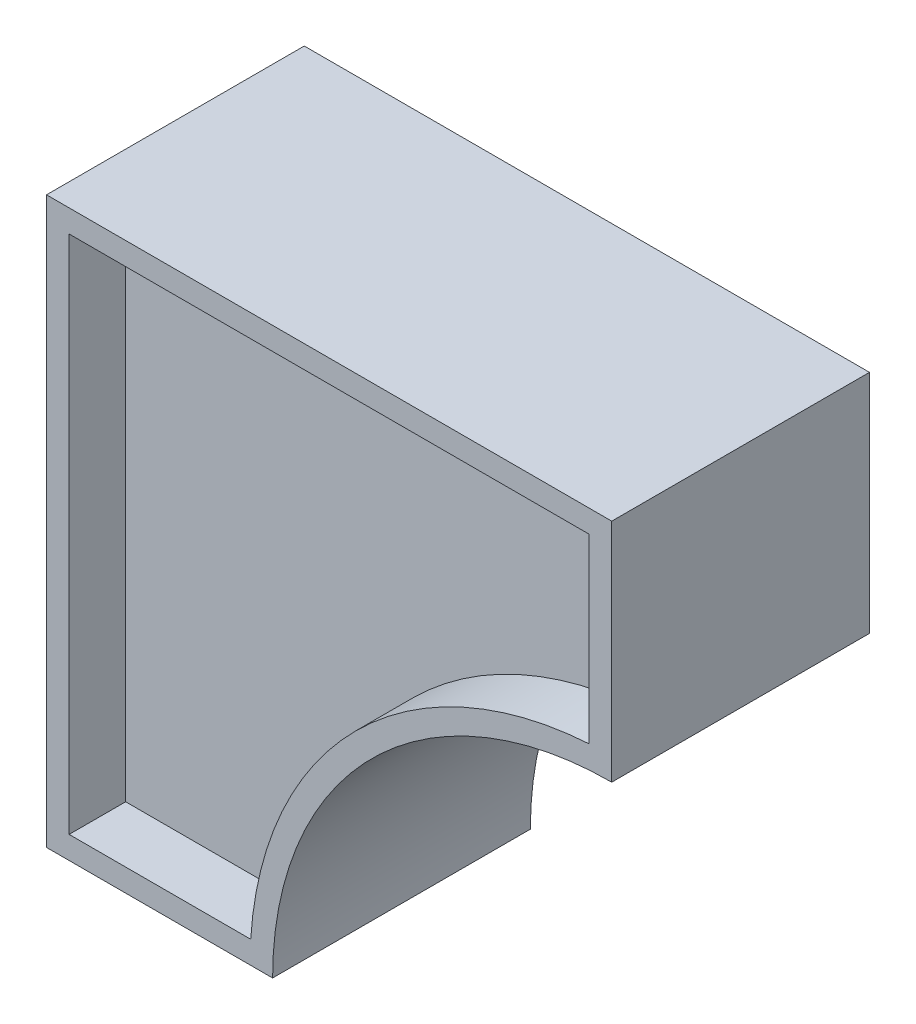
ISO-10303-21;
HEADER;
FILE_DESCRIPTION(('STEP AP214'),'2;1');
FILE_NAME('part.step','',(''),(''),'','','');
FILE_SCHEMA(('AUTOMOTIVE_DESIGN { 1 0 10303 214 1 1 1 1 }'));
ENDSEC;
DATA;
#1=APPLICATION_CONTEXT('core data for automotive mechanical design processes');
#2=APPLICATION_PROTOCOL_DEFINITION('international standard','automotive_design',2000,#1);
#3=PRODUCT_CONTEXT('',#1,'mechanical');
#4=PRODUCT('Part','Part','',(#3));
#5=PRODUCT_RELATED_PRODUCT_CATEGORY('part','',(#4));
#6=PRODUCT_DEFINITION_FORMATION('','',#4);
#7=PRODUCT_DEFINITION_CONTEXT('part definition',#1,'design');
#8=PRODUCT_DEFINITION('design','',#6,#7);
#9=PRODUCT_DEFINITION_SHAPE('','',#8);
#10=(LENGTH_UNIT() NAMED_UNIT(*) SI_UNIT(.MILLI.,.METRE.));
#11=(NAMED_UNIT(*) PLANE_ANGLE_UNIT() SI_UNIT($,.RADIAN.));
#12=(NAMED_UNIT(*) SI_UNIT($,.STERADIAN.) SOLID_ANGLE_UNIT());
#13=UNCERTAINTY_MEASURE_WITH_UNIT(LENGTH_MEASURE(1.E-05),#10,'distance_accuracy_value','');
#14=(GEOMETRIC_REPRESENTATION_CONTEXT(3) GLOBAL_UNCERTAINTY_ASSIGNED_CONTEXT((#13)) GLOBAL_UNIT_ASSIGNED_CONTEXT((#10,
#11,#12)) REPRESENTATION_CONTEXT('',''));
#15=CARTESIAN_POINT('',(0.,0.,0.));
#16=DIRECTION('',(0.,0.,1.));
#17=DIRECTION('',(1.,0.,0.));
#18=AXIS2_PLACEMENT_3D('',#15,#16,#17);
#19=CARTESIAN_POINT('',(0.,0.,28.956));
#20=DIRECTION('',(1.,0.,0.));
#21=DIRECTION('',(0.,1.,0.));
#22=AXIS2_PLACEMENT_3D('',#19,#20,#21);
#23=PLANE('',#22);
#24=DIRECTION('',(0.,-1.,0.));
#25=VECTOR('',#24,1.);
#26=CARTESIAN_POINT('',(0.,0.,0.));
#27=LINE('',#26,#25);
#28=CARTESIAN_POINT('',(0.,0.,0.));
#29=VERTEX_POINT('',#28);
#30=CARTESIAN_POINT('',(0.,-63.5,0.));
#31=VERTEX_POINT('',#30);
#32=EDGE_CURVE('E119',#29,#31,#27,.T.);
#33=ORIENTED_EDGE('',*,*,#32,.T.);
#34=DIRECTION('',(0.,0.,-1.));
#35=VECTOR('',#34,1.);
#36=CARTESIAN_POINT('',(0.,-63.5,28.956));
#37=LINE('',#36,#35);
#38=CARTESIAN_POINT('',(0.,-63.5,28.956));
#39=VERTEX_POINT('',#38);
#40=EDGE_CURVE('E11',#39,#31,#37,.T.);
#41=ORIENTED_EDGE('',*,*,#40,.F.);
#42=DIRECTION('',(0.,-1.,0.));
#43=VECTOR('',#42,1.);
#44=CARTESIAN_POINT('',(0.,0.,28.956));
#45=LINE('',#44,#43);
#46=CARTESIAN_POINT('',(0.,0.,28.956));
#47=VERTEX_POINT('',#46);
#48=EDGE_CURVE('E129',#47,#39,#45,.T.);
#49=ORIENTED_EDGE('',*,*,#48,.F.);
#50=DIRECTION('',(0.,0.,-1.));
#51=VECTOR('',#50,1.);
#52=CARTESIAN_POINT('',(0.,0.,28.956));
#53=LINE('',#52,#51);
#54=EDGE_CURVE('E115',#47,#29,#53,.T.);
#55=ORIENTED_EDGE('',*,*,#54,.T.);
#56=EDGE_LOOP('',(#33,#41,#49,#55));
#57=FACE_BOUND('',#56,.T.);
#58=ADVANCED_FACE('F33',(#57),#23,.F.);
#59=CARTESIAN_POINT('',(0.,-63.5,28.956));
#60=DIRECTION('',(0.,1.,0.));
#61=DIRECTION('',(0.,0.,1.));
#62=AXIS2_PLACEMENT_3D('',#59,#60,#61);
#63=PLANE('',#62);
#64=DIRECTION('',(1.,0.,0.));
#65=VECTOR('',#64,1.);
#66=CARTESIAN_POINT('',(0.,-63.5,0.));
#67=LINE('',#66,#65);
#68=CARTESIAN_POINT('',(25.4,-63.5,0.));
#69=VERTEX_POINT('',#68);
#70=EDGE_CURVE('E122',#31,#69,#67,.T.);
#71=ORIENTED_EDGE('',*,*,#70,.T.);
#72=DIRECTION('',(0.,0.,-1.));
#73=VECTOR('',#72,1.);
#74=CARTESIAN_POINT('',(25.4,-63.5,28.956));
#75=LINE('',#74,#73);
#76=CARTESIAN_POINT('',(25.4,-63.5,28.956));
#77=VERTEX_POINT('',#76);
#78=EDGE_CURVE('E40',#77,#69,#75,.T.);
#79=ORIENTED_EDGE('',*,*,#78,.F.);
#80=DIRECTION('',(1.,0.,0.));
#81=VECTOR('',#80,1.);
#82=CARTESIAN_POINT('',(0.,-63.5,28.956));
#83=LINE('',#82,#81);
#84=EDGE_CURVE('E88',#39,#77,#83,.T.);
#85=ORIENTED_EDGE('',*,*,#84,.F.);
#86=ORIENTED_EDGE('',*,*,#40,.T.);
#87=EDGE_LOOP('',(#71,#79,#85,#86));
#88=FACE_BOUND('',#87,.T.);
#89=ADVANCED_FACE('F227',(#88),#63,.F.);
#90=CARTESIAN_POINT('',(63.5,-63.5,28.956));
#91=DIRECTION('',(0.,0.,-1.));
#92=DIRECTION('',(-1.,0.,0.));
#93=AXIS2_PLACEMENT_3D('',#90,#91,#92);
#94=CYLINDRICAL_SURFACE('',#93,38.1);
#95=CARTESIAN_POINT('',(63.5,-63.5,0.));
#96=DIRECTION('',(0.,0.,-1.));
#97=DIRECTION('',(1.,0.,0.));
#98=AXIS2_PLACEMENT_3D('',#95,#96,#97);
#99=CIRCLE('',#98,38.1);
#100=CARTESIAN_POINT('',(63.5,-25.4,0.));
#101=VERTEX_POINT('',#100);
#102=EDGE_CURVE('E108',#69,#101,#99,.T.);
#103=ORIENTED_EDGE('',*,*,#102,.T.);
#104=DIRECTION('',(0.,0.,-1.));
#105=VECTOR('',#104,1.);
#106=CARTESIAN_POINT('',(63.5,-25.4,28.956));
#107=LINE('',#106,#105);
#108=CARTESIAN_POINT('',(63.5,-25.4,28.956));
#109=VERTEX_POINT('',#108);
#110=EDGE_CURVE('E105',#109,#101,#107,.T.);
#111=ORIENTED_EDGE('',*,*,#110,.F.);
#112=CARTESIAN_POINT('',(63.5,-63.5,28.956));
#113=DIRECTION('',(0.,0.,-1.));
#114=DIRECTION('',(1.,0.,0.));
#115=AXIS2_PLACEMENT_3D('',#112,#113,#114);
#116=CIRCLE('',#115,38.1);
#117=EDGE_CURVE('E95',#77,#109,#116,.T.);
#118=ORIENTED_EDGE('',*,*,#117,.F.);
#119=ORIENTED_EDGE('',*,*,#78,.T.);
#120=EDGE_LOOP('',(#103,#111,#118,#119));
#121=FACE_BOUND('',#120,.T.);
#122=ADVANCED_FACE('F106',(#121),#94,.F.);
#123=CARTESIAN_POINT('',(63.5,0.,28.956));
#124=DIRECTION('',(-1.,0.,0.));
#125=DIRECTION('',(0.,-1.,0.));
#126=AXIS2_PLACEMENT_3D('',#123,#124,#125);
#127=PLANE('',#126);
#128=DIRECTION('',(0.,1.,0.));
#129=VECTOR('',#128,1.);
#130=CARTESIAN_POINT('',(63.5,0.,0.));
#131=LINE('',#130,#129);
#132=CARTESIAN_POINT('',(63.5,0.,0.));
#133=VERTEX_POINT('',#132);
#134=EDGE_CURVE('E126',#101,#133,#131,.T.);
#135=ORIENTED_EDGE('',*,*,#134,.T.);
#136=DIRECTION('',(0.,0.,-1.));
#137=VECTOR('',#136,1.);
#138=CARTESIAN_POINT('',(63.5,0.,28.956));
#139=LINE('',#138,#137);
#140=CARTESIAN_POINT('',(63.5,0.,28.956));
#141=VERTEX_POINT('',#140);
#142=EDGE_CURVE('E111',#141,#133,#139,.T.);
#143=ORIENTED_EDGE('',*,*,#142,.F.);
#144=DIRECTION('',(0.,1.,0.));
#145=VECTOR('',#144,1.);
#146=CARTESIAN_POINT('',(63.5,0.,28.956));
#147=LINE('',#146,#145);
#148=EDGE_CURVE('E99',#109,#141,#147,.T.);
#149=ORIENTED_EDGE('',*,*,#148,.F.);
#150=ORIENTED_EDGE('',*,*,#110,.T.);
#151=EDGE_LOOP('',(#135,#143,#149,#150));
#152=FACE_BOUND('',#151,.T.);
#153=ADVANCED_FACE('F113',(#152),#127,.F.);
#154=CARTESIAN_POINT('',(0.,0.,28.956));
#155=DIRECTION('',(0.,-1.,0.));
#156=DIRECTION('',(0.,0.,-1.));
#157=AXIS2_PLACEMENT_3D('',#154,#155,#156);
#158=PLANE('',#157);
#159=DIRECTION('',(-1.,0.,0.));
#160=VECTOR('',#159,1.);
#161=CARTESIAN_POINT('',(0.,0.,0.));
#162=LINE('',#161,#160);
#163=EDGE_CURVE('E80',#133,#29,#162,.T.);
#164=ORIENTED_EDGE('',*,*,#163,.T.);
#165=ORIENTED_EDGE('',*,*,#54,.F.);
#166=DIRECTION('',(-1.,0.,0.));
#167=VECTOR('',#166,1.);
#168=CARTESIAN_POINT('',(0.,0.,28.956));
#169=LINE('',#168,#167);
#170=EDGE_CURVE('E56',#141,#47,#169,.T.);
#171=ORIENTED_EDGE('',*,*,#170,.F.);
#172=ORIENTED_EDGE('',*,*,#142,.T.);
#173=EDGE_LOOP('',(#164,#165,#171,#172));
#174=FACE_BOUND('',#173,.T.);
#175=ADVANCED_FACE('F134',(#174),#158,.F.);
#176=CARTESIAN_POINT('',(63.5,-63.5,28.956));
#177=DIRECTION('',(0.,0.,1.));
#178=DIRECTION('',(1.,0.,0.));
#179=AXIS2_PLACEMENT_3D('',#176,#177,#178);
#180=PLANE('',#179);
#181=DIRECTION('',(-1.,0.,0.));
#182=VECTOR('',#181,1.);
#183=CARTESIAN_POINT('',(60.96,-2.54,28.956));
#184=LINE('',#183,#182);
#185=CARTESIAN_POINT('',(60.96,-2.54,28.956));
#186=VERTEX_POINT('',#185);
#187=CARTESIAN_POINT('',(2.54,-2.54,28.956));
#188=VERTEX_POINT('',#187);
#189=EDGE_CURVE('E47',#186,#188,#184,.T.);
#190=ORIENTED_EDGE('',*,*,#189,.F.);
#191=DIRECTION('',(0.,1.,0.));
#192=VECTOR('',#191,1.);
#193=CARTESIAN_POINT('',(60.96,-22.9394526664149,28.956));
#194=LINE('',#193,#192);
#195=CARTESIAN_POINT('',(60.96,-22.9394526664149,28.956));
#196=VERTEX_POINT('',#195);
#197=EDGE_CURVE('E153',#196,#186,#194,.T.);
#198=ORIENTED_EDGE('',*,*,#197,.F.);
#199=CARTESIAN_POINT('',(63.5,-63.5,28.956));
#200=DIRECTION('',(0.,0.,-1.));
#201=DIRECTION('',(1.,0.,0.));
#202=AXIS2_PLACEMENT_3D('',#199,#200,#201);
#203=CIRCLE('',#202,40.64);
#204=CARTESIAN_POINT('',(22.9394526664149,-60.96,28.956));
#205=VERTEX_POINT('',#204);
#206=EDGE_CURVE('E157',#205,#196,#203,.T.);
#207=ORIENTED_EDGE('',*,*,#206,.F.);
#208=DIRECTION('',(1.,0.,0.));
#209=VECTOR('',#208,1.);
#210=CARTESIAN_POINT('',(2.54000000000002,-60.96,28.956));
#211=LINE('',#210,#209);
#212=CARTESIAN_POINT('',(2.54000000000002,-60.96,28.956));
#213=VERTEX_POINT('',#212);
#214=EDGE_CURVE('E160',#213,#205,#211,.T.);
#215=ORIENTED_EDGE('',*,*,#214,.F.);
#216=DIRECTION('',(0.,-1.,0.));
#217=VECTOR('',#216,1.);
#218=CARTESIAN_POINT('',(2.54,-2.54,28.956));
#219=LINE('',#218,#217);
#220=EDGE_CURVE('E163',#188,#213,#219,.T.);
#221=ORIENTED_EDGE('',*,*,#220,.F.);
#222=EDGE_LOOP('',(#190,#198,#207,#215,#221));
#223=FACE_BOUND('',#222,.T.);
#224=ORIENTED_EDGE('',*,*,#48,.T.);
#225=ORIENTED_EDGE('',*,*,#84,.T.);
#226=ORIENTED_EDGE('',*,*,#117,.T.);
#227=ORIENTED_EDGE('',*,*,#148,.T.);
#228=ORIENTED_EDGE('',*,*,#170,.T.);
#229=EDGE_LOOP('',(#224,#225,#226,#227,#228));
#230=FACE_BOUND('',#229,.T.);
#231=ADVANCED_FACE('F97',(#223,#230),#180,.T.);
#232=CARTESIAN_POINT('',(63.5,-63.5,0.));
#233=DIRECTION('',(0.,0.,1.));
#234=DIRECTION('',(1.,0.,0.));
#235=AXIS2_PLACEMENT_3D('',#232,#233,#234);
#236=PLANE('',#235);
#237=ORIENTED_EDGE('',*,*,#32,.F.);
#238=ORIENTED_EDGE('',*,*,#163,.F.);
#239=ORIENTED_EDGE('',*,*,#134,.F.);
#240=ORIENTED_EDGE('',*,*,#102,.F.);
#241=ORIENTED_EDGE('',*,*,#70,.F.);
#242=EDGE_LOOP('',(#237,#238,#239,#240,#241));
#243=FACE_BOUND('',#242,.T.);
#244=ADVANCED_FACE('F133',(#243),#236,.F.);
#245=CARTESIAN_POINT('',(60.96,-2.54,22.606));
#246=DIRECTION('',(0.,1.,0.));
#247=DIRECTION('',(0.,0.,1.));
#248=AXIS2_PLACEMENT_3D('',#245,#246,#247);
#249=PLANE('',#248);
#250=ORIENTED_EDGE('',*,*,#189,.T.);
#251=DIRECTION('',(0.,0.,1.));
#252=VECTOR('',#251,1.);
#253=CARTESIAN_POINT('',(2.54,-2.54,22.606));
#254=LINE('',#253,#252);
#255=CARTESIAN_POINT('',(2.54,-2.54,22.606));
#256=VERTEX_POINT('',#255);
#257=EDGE_CURVE('E140',#256,#188,#254,.T.);
#258=ORIENTED_EDGE('',*,*,#257,.F.);
#259=DIRECTION('',(-1.,0.,0.));
#260=VECTOR('',#259,1.);
#261=CARTESIAN_POINT('',(60.96,-2.54,22.606));
#262=LINE('',#261,#260);
#263=CARTESIAN_POINT('',(60.96,-2.54,22.606));
#264=VERTEX_POINT('',#263);
#265=EDGE_CURVE('E156',#264,#256,#262,.T.);
#266=ORIENTED_EDGE('',*,*,#265,.F.);
#267=DIRECTION('',(0.,0.,1.));
#268=VECTOR('',#267,1.);
#269=CARTESIAN_POINT('',(60.96,-2.54,22.606));
#270=LINE('',#269,#268);
#271=EDGE_CURVE('E123',#264,#186,#270,.T.);
#272=ORIENTED_EDGE('',*,*,#271,.T.);
#273=EDGE_LOOP('',(#250,#258,#266,#272));
#274=FACE_BOUND('',#273,.T.);
#275=ADVANCED_FACE('F187',(#274),#249,.F.);
#276=CARTESIAN_POINT('',(60.96,-22.9394526664149,22.606));
#277=DIRECTION('',(1.,0.,0.));
#278=DIRECTION('',(0.,1.,0.));
#279=AXIS2_PLACEMENT_3D('',#276,#277,#278);
#280=PLANE('',#279);
#281=ORIENTED_EDGE('',*,*,#197,.T.);
#282=ORIENTED_EDGE('',*,*,#271,.F.);
#283=DIRECTION('',(0.,1.,0.));
#284=VECTOR('',#283,1.);
#285=CARTESIAN_POINT('',(60.96,-22.9394526664149,22.606));
#286=LINE('',#285,#284);
#287=CARTESIAN_POINT('',(60.96,-22.9394526664149,22.606));
#288=VERTEX_POINT('',#287);
#289=EDGE_CURVE('E143',#288,#264,#286,.T.);
#290=ORIENTED_EDGE('',*,*,#289,.F.);
#291=DIRECTION('',(0.,0.,1.));
#292=VECTOR('',#291,1.);
#293=CARTESIAN_POINT('',(60.96,-22.9394526664149,22.606));
#294=LINE('',#293,#292);
#295=EDGE_CURVE('E149',#288,#196,#294,.T.);
#296=ORIENTED_EDGE('',*,*,#295,.T.);
#297=EDGE_LOOP('',(#281,#282,#290,#296));
#298=FACE_BOUND('',#297,.T.);
#299=ADVANCED_FACE('F201',(#298),#280,.F.);
#300=CARTESIAN_POINT('',(63.5,-63.5,22.606));
#301=DIRECTION('',(0.,0.,1.));
#302=DIRECTION('',(1.,0.,0.));
#303=AXIS2_PLACEMENT_3D('',#300,#301,#302);
#304=CYLINDRICAL_SURFACE('',#303,40.64);
#305=ORIENTED_EDGE('',*,*,#206,.T.);
#306=ORIENTED_EDGE('',*,*,#295,.F.);
#307=CARTESIAN_POINT('',(63.5,-63.5,22.606));
#308=DIRECTION('',(0.,0.,-1.));
#309=DIRECTION('',(1.,0.,0.));
#310=AXIS2_PLACEMENT_3D('',#307,#308,#309);
#311=CIRCLE('',#310,40.64);
#312=CARTESIAN_POINT('',(22.9394526664149,-60.96,22.606));
#313=VERTEX_POINT('',#312);
#314=EDGE_CURVE('E169',#313,#288,#311,.T.);
#315=ORIENTED_EDGE('',*,*,#314,.F.);
#316=DIRECTION('',(0.,0.,1.));
#317=VECTOR('',#316,1.);
#318=CARTESIAN_POINT('',(22.9394526664149,-60.96,22.606));
#319=LINE('',#318,#317);
#320=EDGE_CURVE('E146',#313,#205,#319,.T.);
#321=ORIENTED_EDGE('',*,*,#320,.T.);
#322=EDGE_LOOP('',(#305,#306,#315,#321));
#323=FACE_BOUND('',#322,.T.);
#324=ADVANCED_FACE('F206',(#323),#304,.T.);
#325=CARTESIAN_POINT('',(2.54000000000002,-60.96,22.606));
#326=DIRECTION('',(0.,-1.,0.));
#327=DIRECTION('',(0.,0.,-1.));
#328=AXIS2_PLACEMENT_3D('',#325,#326,#327);
#329=PLANE('',#328);
#330=ORIENTED_EDGE('',*,*,#214,.T.);
#331=ORIENTED_EDGE('',*,*,#320,.F.);
#332=DIRECTION('',(1.,0.,0.));
#333=VECTOR('',#332,1.);
#334=CARTESIAN_POINT('',(2.54000000000002,-60.96,22.606));
#335=LINE('',#334,#333);
#336=CARTESIAN_POINT('',(2.54000000000002,-60.96,22.606));
#337=VERTEX_POINT('',#336);
#338=EDGE_CURVE('E172',#337,#313,#335,.T.);
#339=ORIENTED_EDGE('',*,*,#338,.F.);
#340=DIRECTION('',(0.,0.,1.));
#341=VECTOR('',#340,1.);
#342=CARTESIAN_POINT('',(2.54000000000002,-60.96,22.606));
#343=LINE('',#342,#341);
#344=EDGE_CURVE('E142',#337,#213,#343,.T.);
#345=ORIENTED_EDGE('',*,*,#344,.T.);
#346=EDGE_LOOP('',(#330,#331,#339,#345));
#347=FACE_BOUND('',#346,.T.);
#348=ADVANCED_FACE('F217',(#347),#329,.F.);
#349=CARTESIAN_POINT('',(2.54,-2.54,22.606));
#350=DIRECTION('',(-1.,0.,0.));
#351=DIRECTION('',(0.,-1.,0.));
#352=AXIS2_PLACEMENT_3D('',#349,#350,#351);
#353=PLANE('',#352);
#354=ORIENTED_EDGE('',*,*,#220,.T.);
#355=ORIENTED_EDGE('',*,*,#344,.F.);
#356=DIRECTION('',(0.,-1.,0.));
#357=VECTOR('',#356,1.);
#358=CARTESIAN_POINT('',(2.54,-2.54,22.606));
#359=LINE('',#358,#357);
#360=EDGE_CURVE('E175',#256,#337,#359,.T.);
#361=ORIENTED_EDGE('',*,*,#360,.F.);
#362=ORIENTED_EDGE('',*,*,#257,.T.);
#363=EDGE_LOOP('',(#354,#355,#361,#362));
#364=FACE_BOUND('',#363,.T.);
#365=ADVANCED_FACE('F213',(#364),#353,.F.);
#366=CARTESIAN_POINT('',(63.5,-63.5,22.606));
#367=DIRECTION('',(0.,0.,1.));
#368=DIRECTION('',(1.,0.,0.));
#369=AXIS2_PLACEMENT_3D('',#366,#367,#368);
#370=PLANE('',#369);
#371=ORIENTED_EDGE('',*,*,#265,.T.);
#372=ORIENTED_EDGE('',*,*,#360,.T.);
#373=ORIENTED_EDGE('',*,*,#338,.T.);
#374=ORIENTED_EDGE('',*,*,#314,.T.);
#375=ORIENTED_EDGE('',*,*,#289,.T.);
#376=EDGE_LOOP('',(#371,#372,#373,#374,#375));
#377=FACE_BOUND('',#376,.T.);
#378=ADVANCED_FACE('F182',(#377),#370,.T.);
#379=CLOSED_SHELL('',(#58,#89,#122,#153,#175,#231,#244,#275,#299,#324,#348,#365,#378));
#380=MANIFOLD_SOLID_BREP('B2',#379);
#381=ADVANCED_BREP_SHAPE_REPRESENTATION('',(#18,#380),#14);
#382=SHAPE_DEFINITION_REPRESENTATION(#9,#381);
ENDSEC;
END-ISO-10303-21;
